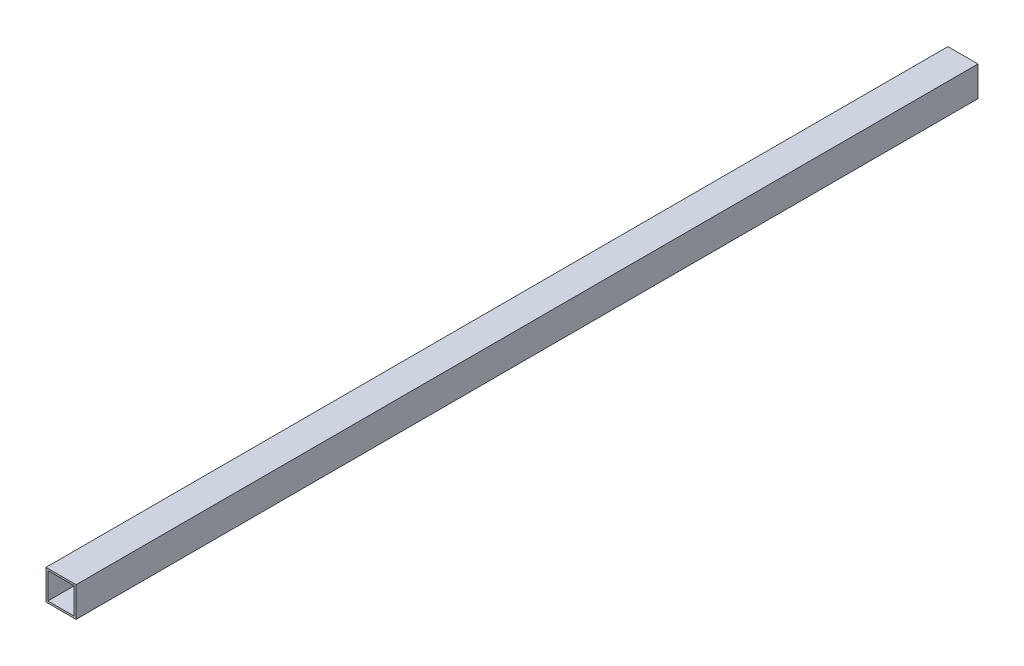
ISO-10303-21;
HEADER;
FILE_DESCRIPTION(('STEP AP214'),'2;1');
FILE_NAME('part.step','',(''),(''),'','','');
FILE_SCHEMA(('AUTOMOTIVE_DESIGN { 1 0 10303 214 1 1 1 1 }'));
ENDSEC;
DATA;
#1=APPLICATION_CONTEXT('core data for automotive mechanical design processes');
#2=APPLICATION_PROTOCOL_DEFINITION('international standard','automotive_design',2000,#1);
#3=PRODUCT_CONTEXT('',#1,'mechanical');
#4=PRODUCT('Part','Part','',(#3));
#5=PRODUCT_RELATED_PRODUCT_CATEGORY('part','',(#4));
#6=PRODUCT_DEFINITION_FORMATION('','',#4);
#7=PRODUCT_DEFINITION_CONTEXT('part definition',#1,'design');
#8=PRODUCT_DEFINITION('design','',#6,#7);
#9=PRODUCT_DEFINITION_SHAPE('','',#8);
#10=(LENGTH_UNIT() NAMED_UNIT(*) SI_UNIT(.MILLI.,.METRE.));
#11=(NAMED_UNIT(*) PLANE_ANGLE_UNIT() SI_UNIT($,.RADIAN.));
#12=(NAMED_UNIT(*) SI_UNIT($,.STERADIAN.) SOLID_ANGLE_UNIT());
#13=UNCERTAINTY_MEASURE_WITH_UNIT(LENGTH_MEASURE(1.E-05),#10,'distance_accuracy_value','');
#14=(GEOMETRIC_REPRESENTATION_CONTEXT(3) GLOBAL_UNCERTAINTY_ASSIGNED_CONTEXT((#13)) GLOBAL_UNIT_ASSIGNED_CONTEXT((#10,
#11,#12)) REPRESENTATION_CONTEXT('',''));
#15=CARTESIAN_POINT('',(0.,0.,0.));
#16=DIRECTION('',(0.,0.,1.));
#17=DIRECTION('',(1.,0.,0.));
#18=AXIS2_PLACEMENT_3D('',#15,#16,#17);
#19=CARTESIAN_POINT('',(0.,0.,1524.));
#20=DIRECTION('',(0.,0.,-1.));
#21=DIRECTION('',(-1.,0.,0.));
#22=AXIS2_PLACEMENT_3D('',#19,#20,#21);
#23=PLANE('',#22);
#24=DIRECTION('',(0.,1.,0.));
#25=VECTOR('',#24,1.);
#26=CARTESIAN_POINT('',(25.4,-25.4,1524.));
#27=LINE('',#26,#25);
#28=CARTESIAN_POINT('',(25.4,-25.4,1524.));
#29=VERTEX_POINT('',#28);
#30=CARTESIAN_POINT('',(25.4,25.4,1524.));
#31=VERTEX_POINT('',#30);
#32=EDGE_CURVE('E134',#29,#31,#27,.T.);
#33=ORIENTED_EDGE('',*,*,#32,.T.);
#34=DIRECTION('',(-1.,0.,0.));
#35=VECTOR('',#34,1.);
#36=CARTESIAN_POINT('',(-25.4,25.4,1524.));
#37=LINE('',#36,#35);
#38=CARTESIAN_POINT('',(-25.4,25.4,1524.));
#39=VERTEX_POINT('',#38);
#40=EDGE_CURVE('E137',#31,#39,#37,.T.);
#41=ORIENTED_EDGE('',*,*,#40,.T.);
#42=DIRECTION('',(0.,-1.,0.));
#43=VECTOR('',#42,1.);
#44=CARTESIAN_POINT('',(-25.4,-25.4,1524.));
#45=LINE('',#44,#43);
#46=CARTESIAN_POINT('',(-25.4,-25.4,1524.));
#47=VERTEX_POINT('',#46);
#48=EDGE_CURVE('E140',#39,#47,#45,.T.);
#49=ORIENTED_EDGE('',*,*,#48,.T.);
#50=DIRECTION('',(1.,0.,0.));
#51=VECTOR('',#50,1.);
#52=CARTESIAN_POINT('',(-25.4,-25.4,1524.));
#53=LINE('',#52,#51);
#54=EDGE_CURVE('E142',#47,#29,#53,.T.);
#55=ORIENTED_EDGE('',*,*,#54,.T.);
#56=EDGE_LOOP('',(#33,#41,#49,#55));
#57=FACE_BOUND('',#56,.T.);
#58=DIRECTION('',(0.,1.,0.));
#59=VECTOR('',#58,1.);
#60=CARTESIAN_POINT('',(22.225,-22.225,1524.));
#61=LINE('',#60,#59);
#62=CARTESIAN_POINT('',(22.225,-22.225,1524.));
#63=VERTEX_POINT('',#62);
#64=CARTESIAN_POINT('',(22.225,22.225,1524.));
#65=VERTEX_POINT('',#64);
#66=EDGE_CURVE('E98',#63,#65,#61,.T.);
#67=ORIENTED_EDGE('',*,*,#66,.F.);
#68=DIRECTION('',(1.,0.,0.));
#69=VECTOR('',#68,1.);
#70=CARTESIAN_POINT('',(-22.225,-22.225,1524.));
#71=LINE('',#70,#69);
#72=CARTESIAN_POINT('',(-22.225,-22.225,1524.));
#73=VERTEX_POINT('',#72);
#74=EDGE_CURVE('E120',#73,#63,#71,.T.);
#75=ORIENTED_EDGE('',*,*,#74,.F.);
#76=DIRECTION('',(0.,-1.,0.));
#77=VECTOR('',#76,1.);
#78=CARTESIAN_POINT('',(-22.225,-22.225,1524.));
#79=LINE('',#78,#77);
#80=CARTESIAN_POINT('',(-22.225,22.225,1524.));
#81=VERTEX_POINT('',#80);
#82=EDGE_CURVE('E118',#81,#73,#79,.T.);
#83=ORIENTED_EDGE('',*,*,#82,.F.);
#84=DIRECTION('',(-1.,0.,0.));
#85=VECTOR('',#84,1.);
#86=CARTESIAN_POINT('',(-22.225,22.225,1524.));
#87=LINE('',#86,#85);
#88=EDGE_CURVE('E106',#65,#81,#87,.T.);
#89=ORIENTED_EDGE('',*,*,#88,.F.);
#90=EDGE_LOOP('',(#67,#75,#83,#89));
#91=FACE_BOUND('',#90,.T.);
#92=ADVANCED_FACE('F33',(#57,#91),#23,.F.);
#93=CARTESIAN_POINT('',(0.,0.,0.));
#94=DIRECTION('',(0.,0.,-1.));
#95=DIRECTION('',(-1.,0.,0.));
#96=AXIS2_PLACEMENT_3D('',#93,#94,#95);
#97=PLANE('',#96);
#98=DIRECTION('',(0.,1.,0.));
#99=VECTOR('',#98,1.);
#100=CARTESIAN_POINT('',(25.4,-25.4,0.));
#101=LINE('',#100,#99);
#102=CARTESIAN_POINT('',(25.4,-25.4,0.));
#103=VERTEX_POINT('',#102);
#104=CARTESIAN_POINT('',(25.4,25.4,0.));
#105=VERTEX_POINT('',#104);
#106=EDGE_CURVE('E114',#103,#105,#101,.T.);
#107=ORIENTED_EDGE('',*,*,#106,.F.);
#108=DIRECTION('',(1.,0.,0.));
#109=VECTOR('',#108,1.);
#110=CARTESIAN_POINT('',(-25.4,-25.4,0.));
#111=LINE('',#110,#109);
#112=CARTESIAN_POINT('',(-25.4,-25.4,0.));
#113=VERTEX_POINT('',#112);
#114=EDGE_CURVE('E138',#113,#103,#111,.T.);
#115=ORIENTED_EDGE('',*,*,#114,.F.);
#116=DIRECTION('',(0.,-1.,0.));
#117=VECTOR('',#116,1.);
#118=CARTESIAN_POINT('',(-25.4,-25.4,0.));
#119=LINE('',#118,#117);
#120=CARTESIAN_POINT('',(-25.4,25.4,0.));
#121=VERTEX_POINT('',#120);
#122=EDGE_CURVE('E149',#121,#113,#119,.T.);
#123=ORIENTED_EDGE('',*,*,#122,.F.);
#124=DIRECTION('',(-1.,0.,0.));
#125=VECTOR('',#124,1.);
#126=CARTESIAN_POINT('',(-25.4,25.4,0.));
#127=LINE('',#126,#125);
#128=EDGE_CURVE('E147',#105,#121,#127,.T.);
#129=ORIENTED_EDGE('',*,*,#128,.F.);
#130=EDGE_LOOP('',(#107,#115,#123,#129));
#131=FACE_BOUND('',#130,.T.);
#132=DIRECTION('',(1.,0.,0.));
#133=VECTOR('',#132,1.);
#134=CARTESIAN_POINT('',(-22.225,-22.225,0.));
#135=LINE('',#134,#133);
#136=CARTESIAN_POINT('',(-22.225,-22.225,0.));
#137=VERTEX_POINT('',#136);
#138=CARTESIAN_POINT('',(22.225,-22.225,0.));
#139=VERTEX_POINT('',#138);
#140=EDGE_CURVE('E107',#137,#139,#135,.T.);
#141=ORIENTED_EDGE('',*,*,#140,.T.);
#142=DIRECTION('',(0.,1.,0.));
#143=VECTOR('',#142,1.);
#144=CARTESIAN_POINT('',(22.225,-22.225,0.));
#145=LINE('',#144,#143);
#146=CARTESIAN_POINT('',(22.225,22.225,0.));
#147=VERTEX_POINT('',#146);
#148=EDGE_CURVE('E56',#139,#147,#145,.T.);
#149=ORIENTED_EDGE('',*,*,#148,.T.);
#150=DIRECTION('',(-1.,0.,0.));
#151=VECTOR('',#150,1.);
#152=CARTESIAN_POINT('',(-22.225,22.225,0.));
#153=LINE('',#152,#151);
#154=CARTESIAN_POINT('',(-22.225,22.225,0.));
#155=VERTEX_POINT('',#154);
#156=EDGE_CURVE('E113',#147,#155,#153,.T.);
#157=ORIENTED_EDGE('',*,*,#156,.T.);
#158=DIRECTION('',(0.,-1.,0.));
#159=VECTOR('',#158,1.);
#160=CARTESIAN_POINT('',(-22.225,-22.225,0.));
#161=LINE('',#160,#159);
#162=EDGE_CURVE('E126',#155,#137,#161,.T.);
#163=ORIENTED_EDGE('',*,*,#162,.T.);
#164=EDGE_LOOP('',(#141,#149,#157,#163));
#165=FACE_BOUND('',#164,.T.);
#166=ADVANCED_FACE('F167',(#131,#165),#97,.T.);
#167=CARTESIAN_POINT('',(25.4,-25.4,1524.));
#168=DIRECTION('',(-1.,0.,0.));
#169=DIRECTION('',(0.,0.,1.));
#170=AXIS2_PLACEMENT_3D('',#167,#168,#169);
#171=PLANE('',#170);
#172=ORIENTED_EDGE('',*,*,#106,.T.);
#173=DIRECTION('',(0.,0.,-1.));
#174=VECTOR('',#173,1.);
#175=CARTESIAN_POINT('',(25.4,25.4,1524.));
#176=LINE('',#175,#174);
#177=EDGE_CURVE('E11',#31,#105,#176,.T.);
#178=ORIENTED_EDGE('',*,*,#177,.F.);
#179=ORIENTED_EDGE('',*,*,#32,.F.);
#180=DIRECTION('',(0.,0.,-1.));
#181=VECTOR('',#180,1.);
#182=CARTESIAN_POINT('',(25.4,-25.4,1524.));
#183=LINE('',#182,#181);
#184=EDGE_CURVE('E144',#29,#103,#183,.T.);
#185=ORIENTED_EDGE('',*,*,#184,.T.);
#186=EDGE_LOOP('',(#172,#178,#179,#185));
#187=FACE_BOUND('',#186,.T.);
#188=ADVANCED_FACE('F35',(#187),#171,.F.);
#189=CARTESIAN_POINT('',(-25.4,25.4,1524.));
#190=DIRECTION('',(0.,-1.,0.));
#191=DIRECTION('',(0.,0.,-1.));
#192=AXIS2_PLACEMENT_3D('',#189,#190,#191);
#193=PLANE('',#192);
#194=ORIENTED_EDGE('',*,*,#128,.T.);
#195=DIRECTION('',(0.,0.,-1.));
#196=VECTOR('',#195,1.);
#197=CARTESIAN_POINT('',(-25.4,25.4,1524.));
#198=LINE('',#197,#196);
#199=EDGE_CURVE('E41',#39,#121,#198,.T.);
#200=ORIENTED_EDGE('',*,*,#199,.F.);
#201=ORIENTED_EDGE('',*,*,#40,.F.);
#202=ORIENTED_EDGE('',*,*,#177,.T.);
#203=EDGE_LOOP('',(#194,#200,#201,#202));
#204=FACE_BOUND('',#203,.T.);
#205=ADVANCED_FACE('F177',(#204),#193,.F.);
#206=CARTESIAN_POINT('',(-25.4,-25.4,1524.));
#207=DIRECTION('',(1.,0.,0.));
#208=DIRECTION('',(0.,0.,-1.));
#209=AXIS2_PLACEMENT_3D('',#206,#207,#208);
#210=PLANE('',#209);
#211=ORIENTED_EDGE('',*,*,#122,.T.);
#212=DIRECTION('',(0.,0.,-1.));
#213=VECTOR('',#212,1.);
#214=CARTESIAN_POINT('',(-25.4,-25.4,1524.));
#215=LINE('',#214,#213);
#216=EDGE_CURVE('E154',#47,#113,#215,.T.);
#217=ORIENTED_EDGE('',*,*,#216,.F.);
#218=ORIENTED_EDGE('',*,*,#48,.F.);
#219=ORIENTED_EDGE('',*,*,#199,.T.);
#220=EDGE_LOOP('',(#211,#217,#218,#219));
#221=FACE_BOUND('',#220,.T.);
#222=ADVANCED_FACE('F161',(#221),#210,.F.);
#223=CARTESIAN_POINT('',(-25.4,-25.4,1524.));
#224=DIRECTION('',(0.,1.,0.));
#225=DIRECTION('',(0.,0.,1.));
#226=AXIS2_PLACEMENT_3D('',#223,#224,#225);
#227=PLANE('',#226);
#228=ORIENTED_EDGE('',*,*,#114,.T.);
#229=ORIENTED_EDGE('',*,*,#184,.F.);
#230=ORIENTED_EDGE('',*,*,#54,.F.);
#231=ORIENTED_EDGE('',*,*,#216,.T.);
#232=EDGE_LOOP('',(#228,#229,#230,#231));
#233=FACE_BOUND('',#232,.T.);
#234=ADVANCED_FACE('F171',(#233),#227,.F.);
#235=CARTESIAN_POINT('',(22.225,-22.225,1524.));
#236=DIRECTION('',(-1.,0.,0.));
#237=DIRECTION('',(0.,0.,1.));
#238=AXIS2_PLACEMENT_3D('',#235,#236,#237);
#239=PLANE('',#238);
#240=ORIENTED_EDGE('',*,*,#148,.F.);
#241=DIRECTION('',(0.,0.,-1.));
#242=VECTOR('',#241,1.);
#243=CARTESIAN_POINT('',(22.225,-22.225,1524.));
#244=LINE('',#243,#242);
#245=EDGE_CURVE('E102',#63,#139,#244,.T.);
#246=ORIENTED_EDGE('',*,*,#245,.F.);
#247=ORIENTED_EDGE('',*,*,#66,.T.);
#248=DIRECTION('',(0.,0.,-1.));
#249=VECTOR('',#248,1.);
#250=CARTESIAN_POINT('',(22.225,22.225,1524.));
#251=LINE('',#250,#249);
#252=EDGE_CURVE('E101',#65,#147,#251,.T.);
#253=ORIENTED_EDGE('',*,*,#252,.T.);
#254=EDGE_LOOP('',(#240,#246,#247,#253));
#255=FACE_BOUND('',#254,.T.);
#256=ADVANCED_FACE('F100',(#255),#239,.T.);
#257=CARTESIAN_POINT('',(-22.225,22.225,1524.));
#258=DIRECTION('',(0.,-1.,0.));
#259=DIRECTION('',(0.,0.,-1.));
#260=AXIS2_PLACEMENT_3D('',#257,#258,#259);
#261=PLANE('',#260);
#262=ORIENTED_EDGE('',*,*,#156,.F.);
#263=ORIENTED_EDGE('',*,*,#252,.F.);
#264=ORIENTED_EDGE('',*,*,#88,.T.);
#265=DIRECTION('',(0.,0.,-1.));
#266=VECTOR('',#265,1.);
#267=CARTESIAN_POINT('',(-22.225,22.225,1524.));
#268=LINE('',#267,#266);
#269=EDGE_CURVE('E115',#81,#155,#268,.T.);
#270=ORIENTED_EDGE('',*,*,#269,.T.);
#271=EDGE_LOOP('',(#262,#263,#264,#270));
#272=FACE_BOUND('',#271,.T.);
#273=ADVANCED_FACE('F110',(#272),#261,.T.);
#274=CARTESIAN_POINT('',(-22.225,-22.225,1524.));
#275=DIRECTION('',(1.,0.,0.));
#276=DIRECTION('',(0.,0.,-1.));
#277=AXIS2_PLACEMENT_3D('',#274,#275,#276);
#278=PLANE('',#277);
#279=ORIENTED_EDGE('',*,*,#162,.F.);
#280=ORIENTED_EDGE('',*,*,#269,.F.);
#281=ORIENTED_EDGE('',*,*,#82,.T.);
#282=DIRECTION('',(0.,0.,-1.));
#283=VECTOR('',#282,1.);
#284=CARTESIAN_POINT('',(-22.225,-22.225,1524.));
#285=LINE('',#284,#283);
#286=EDGE_CURVE('E48',#73,#137,#285,.T.);
#287=ORIENTED_EDGE('',*,*,#286,.T.);
#288=EDGE_LOOP('',(#279,#280,#281,#287));
#289=FACE_BOUND('',#288,.T.);
#290=ADVANCED_FACE('F200',(#289),#278,.T.);
#291=CARTESIAN_POINT('',(-22.225,-22.225,1524.));
#292=DIRECTION('',(0.,1.,0.));
#293=DIRECTION('',(0.,0.,1.));
#294=AXIS2_PLACEMENT_3D('',#291,#292,#293);
#295=PLANE('',#294);
#296=ORIENTED_EDGE('',*,*,#140,.F.);
#297=ORIENTED_EDGE('',*,*,#286,.F.);
#298=ORIENTED_EDGE('',*,*,#74,.T.);
#299=ORIENTED_EDGE('',*,*,#245,.T.);
#300=EDGE_LOOP('',(#296,#297,#298,#299));
#301=FACE_BOUND('',#300,.T.);
#302=ADVANCED_FACE('F204',(#301),#295,.T.);
#303=CLOSED_SHELL('',(#92,#166,#188,#205,#222,#234,#256,#273,#290,#302));
#304=MANIFOLD_SOLID_BREP('B2',#303);
#305=ADVANCED_BREP_SHAPE_REPRESENTATION('',(#18,#304),#14);
#306=SHAPE_DEFINITION_REPRESENTATION(#9,#305);
ENDSEC;
END-ISO-10303-21;
